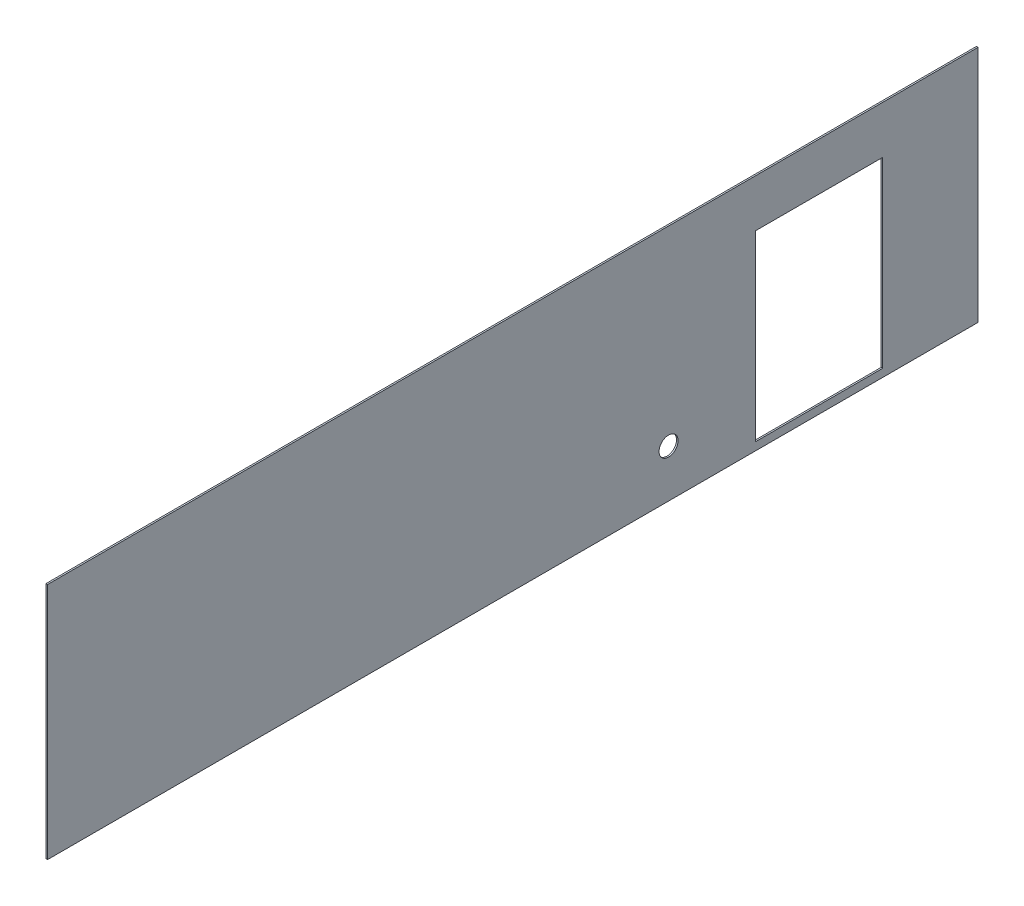
ISO-10303-21;
HEADER;
FILE_DESCRIPTION(('STEP AP214'),'2;1');
FILE_NAME('part.step','',(''),(''),'','','');
FILE_SCHEMA(('AUTOMOTIVE_DESIGN { 1 0 10303 214 1 1 1 1 }'));
ENDSEC;
DATA;
#1=APPLICATION_CONTEXT('core data for automotive mechanical design processes');
#2=APPLICATION_PROTOCOL_DEFINITION('international standard','automotive_design',2000,#1);
#3=PRODUCT_CONTEXT('',#1,'mechanical');
#4=PRODUCT('Part','Part','',(#3));
#5=PRODUCT_RELATED_PRODUCT_CATEGORY('part','',(#4));
#6=PRODUCT_DEFINITION_FORMATION('','',#4);
#7=PRODUCT_DEFINITION_CONTEXT('part definition',#1,'design');
#8=PRODUCT_DEFINITION('design','',#6,#7);
#9=PRODUCT_DEFINITION_SHAPE('','',#8);
#10=(LENGTH_UNIT() NAMED_UNIT(*) SI_UNIT(.MILLI.,.METRE.));
#11=(NAMED_UNIT(*) PLANE_ANGLE_UNIT() SI_UNIT($,.RADIAN.));
#12=(NAMED_UNIT(*) SI_UNIT($,.STERADIAN.) SOLID_ANGLE_UNIT());
#13=UNCERTAINTY_MEASURE_WITH_UNIT(LENGTH_MEASURE(1.E-05),#10,'distance_accuracy_value','');
#14=(GEOMETRIC_REPRESENTATION_CONTEXT(3) GLOBAL_UNCERTAINTY_ASSIGNED_CONTEXT((#13)) GLOBAL_UNIT_ASSIGNED_CONTEXT((#10,
#11,#12)) REPRESENTATION_CONTEXT('',''));
#15=CARTESIAN_POINT('',(0.,0.,0.));
#16=DIRECTION('',(0.,0.,1.));
#17=DIRECTION('',(1.,0.,0.));
#18=AXIS2_PLACEMENT_3D('',#15,#16,#17);
#19=CARTESIAN_POINT('',(0.,0.,-371.948016104997));
#20=DIRECTION('',(0.,0.,1.));
#21=DIRECTION('',(1.,0.,0.));
#22=AXIS2_PLACEMENT_3D('',#19,#20,#21);
#23=PLANE('',#22);
#24=DIRECTION('',(0.,1.,0.));
#25=VECTOR('',#24,1.);
#26=CARTESIAN_POINT('',(-235.9025,47.625,-371.948016104997));
#27=LINE('',#26,#25);
#28=CARTESIAN_POINT('',(-235.9025,-47.625,-371.948016104997));
#29=VERTEX_POINT('',#28);
#30=CARTESIAN_POINT('',(-235.9025,47.625,-371.948016104997));
#31=VERTEX_POINT('',#30);
#32=EDGE_CURVE('E212',#29,#31,#27,.T.);
#33=ORIENTED_EDGE('',*,*,#32,.F.);
#34=DIRECTION('',(-1.,0.,0.));
#35=VECTOR('',#34,1.);
#36=CARTESIAN_POINT('',(-236.5375,-47.625,-371.948016104997));
#37=LINE('',#36,#35);
#38=CARTESIAN_POINT('',(-236.5375,-47.625,-371.948016104997));
#39=VERTEX_POINT('',#38);
#40=EDGE_CURVE('E154',#29,#39,#37,.T.);
#41=ORIENTED_EDGE('',*,*,#40,.T.);
#42=DIRECTION('',(0.,1.,0.));
#43=VECTOR('',#42,1.);
#44=CARTESIAN_POINT('',(-236.5375,47.625,-371.948016104997));
#45=LINE('',#44,#43);
#46=CARTESIAN_POINT('',(-236.5375,47.625,-371.948016104997));
#47=VERTEX_POINT('',#46);
#48=EDGE_CURVE('E162',#39,#47,#45,.T.);
#49=ORIENTED_EDGE('',*,*,#48,.T.);
#50=DIRECTION('',(1.,0.,0.));
#51=VECTOR('',#50,1.);
#52=CARTESIAN_POINT('',(-236.5375,47.625,-371.948016104997));
#53=LINE('',#52,#51);
#54=EDGE_CURVE('E150',#47,#31,#53,.T.);
#55=ORIENTED_EDGE('',*,*,#54,.T.);
#56=EDGE_LOOP('',(#33,#41,#49,#55));
#57=FACE_BOUND('',#56,.T.);
#58=ADVANCED_FACE('F63',(#57),#23,.F.);
#59=CARTESIAN_POINT('',(144.4625,-28.575,-248.250016104997));
#60=DIRECTION('',(-1.,0.,0.));
#61=DIRECTION('',(0.,0.,1.));
#62=AXIS2_PLACEMENT_3D('',#59,#60,#61);
#63=CYLINDRICAL_SURFACE('',#62,3.81000000000004);
#64=CARTESIAN_POINT('',(-236.5375,-28.575,-248.250016104997));
#65=DIRECTION('',(-1.,0.,0.));
#66=DIRECTION('',(0.,0.,1.));
#67=AXIS2_PLACEMENT_3D('',#64,#65,#66);
#68=CIRCLE('',#67,3.81000000000004);
#69=CARTESIAN_POINT('',(-236.5375,-28.575,-244.440016104997));
#70=VERTEX_POINT('',#69);
#71=EDGE_CURVE('E166',#70,#70,#68,.T.);
#72=ORIENTED_EDGE('',*,*,#71,.T.);
#73=EDGE_LOOP('',(#72));
#74=FACE_BOUND('',#73,.T.);
#75=CARTESIAN_POINT('',(-235.9025,-28.575,-248.250016104997));
#76=DIRECTION('',(1.,0.,0.));
#77=DIRECTION('',(0.,0.,-1.));
#78=AXIS2_PLACEMENT_3D('',#75,#76,#77);
#79=CIRCLE('',#78,3.81000000000004);
#80=CARTESIAN_POINT('',(-235.9025,-28.575,-252.060016104997));
#81=VERTEX_POINT('',#80);
#82=EDGE_CURVE('E171',#81,#81,#79,.F.);
#83=ORIENTED_EDGE('',*,*,#82,.F.);
#84=EDGE_LOOP('',(#83));
#85=FACE_BOUND('',#84,.T.);
#86=ADVANCED_FACE('F226',(#74,#85),#63,.F.);
#87=CARTESIAN_POINT('',(144.4625,28.575,-333.848016104997));
#88=DIRECTION('',(0.,0.,-1.));
#89=DIRECTION('',(-1.,0.,0.));
#90=AXIS2_PLACEMENT_3D('',#87,#88,#89);
#91=PLANE('',#90);
#92=DIRECTION('',(0.,-1.,0.));
#93=VECTOR('',#92,1.);
#94=CARTESIAN_POINT('',(-235.9025,28.575,-333.848016104997));
#95=LINE('',#94,#93);
#96=CARTESIAN_POINT('',(-235.9025,28.575,-333.848016104997));
#97=VERTEX_POINT('',#96);
#98=CARTESIAN_POINT('',(-235.9025,-44.45,-333.848016104997));
#99=VERTEX_POINT('',#98);
#100=EDGE_CURVE('E86',#97,#99,#95,.T.);
#101=ORIENTED_EDGE('',*,*,#100,.F.);
#102=DIRECTION('',(-1.,0.,0.));
#103=VECTOR('',#102,1.);
#104=CARTESIAN_POINT('',(144.4625,28.575,-333.848016104997));
#105=LINE('',#104,#103);
#106=CARTESIAN_POINT('',(-236.5375,28.575,-333.848016104997));
#107=VERTEX_POINT('',#106);
#108=EDGE_CURVE('E165',#97,#107,#105,.T.);
#109=ORIENTED_EDGE('',*,*,#108,.T.);
#110=DIRECTION('',(0.,-1.,0.));
#111=VECTOR('',#110,1.);
#112=CARTESIAN_POINT('',(-236.5375,28.575,-333.848016104997));
#113=LINE('',#112,#111);
#114=CARTESIAN_POINT('',(-236.5375,-44.45,-333.848016104997));
#115=VERTEX_POINT('',#114);
#116=EDGE_CURVE('E170',#107,#115,#113,.T.);
#117=ORIENTED_EDGE('',*,*,#116,.T.);
#118=DIRECTION('',(-1.,0.,0.));
#119=VECTOR('',#118,1.);
#120=CARTESIAN_POINT('',(144.4625,-44.45,-333.848016104997));
#121=LINE('',#120,#119);
#122=EDGE_CURVE('E172',#99,#115,#121,.T.);
#123=ORIENTED_EDGE('',*,*,#122,.F.);
#124=EDGE_LOOP('',(#101,#109,#117,#123));
#125=FACE_BOUND('',#124,.T.);
#126=ADVANCED_FACE('F231',(#125),#91,.F.);
#127=CARTESIAN_POINT('',(144.4625,28.575,-333.848016104997));
#128=DIRECTION('',(0.,1.,0.));
#129=DIRECTION('',(0.,0.,1.));
#130=AXIS2_PLACEMENT_3D('',#127,#128,#129);
#131=PLANE('',#130);
#132=DIRECTION('',(0.,0.,-1.));
#133=VECTOR('',#132,1.);
#134=CARTESIAN_POINT('',(-235.9025,28.575,-333.848016104997));
#135=LINE('',#134,#133);
#136=CARTESIAN_POINT('',(-235.9025,28.575,-283.048016104997));
#137=VERTEX_POINT('',#136);
#138=EDGE_CURVE('E203',#137,#97,#135,.T.);
#139=ORIENTED_EDGE('',*,*,#138,.F.);
#140=DIRECTION('',(-1.,0.,0.));
#141=VECTOR('',#140,1.);
#142=CARTESIAN_POINT('',(144.4625,28.575,-283.048016104997));
#143=LINE('',#142,#141);
#144=CARTESIAN_POINT('',(-236.5375,28.575,-283.048016104997));
#145=VERTEX_POINT('',#144);
#146=EDGE_CURVE('E179',#137,#145,#143,.T.);
#147=ORIENTED_EDGE('',*,*,#146,.T.);
#148=DIRECTION('',(0.,0.,-1.));
#149=VECTOR('',#148,1.);
#150=CARTESIAN_POINT('',(-236.5375,28.575,-333.848016104997));
#151=LINE('',#150,#149);
#152=EDGE_CURVE('E176',#145,#107,#151,.T.);
#153=ORIENTED_EDGE('',*,*,#152,.T.);
#154=ORIENTED_EDGE('',*,*,#108,.F.);
#155=EDGE_LOOP('',(#139,#147,#153,#154));
#156=FACE_BOUND('',#155,.T.);
#157=ADVANCED_FACE('F258',(#156),#131,.F.);
#158=CARTESIAN_POINT('',(144.4625,28.575,-283.048016104997));
#159=DIRECTION('',(0.,0.,1.));
#160=DIRECTION('',(1.,0.,0.));
#161=AXIS2_PLACEMENT_3D('',#158,#159,#160);
#162=PLANE('',#161);
#163=DIRECTION('',(0.,1.,0.));
#164=VECTOR('',#163,1.);
#165=CARTESIAN_POINT('',(-235.9025,28.575,-283.048016104997));
#166=LINE('',#165,#164);
#167=CARTESIAN_POINT('',(-235.9025,-44.45,-283.048016104997));
#168=VERTEX_POINT('',#167);
#169=EDGE_CURVE('E206',#168,#137,#166,.T.);
#170=ORIENTED_EDGE('',*,*,#169,.F.);
#171=DIRECTION('',(-1.,0.,0.));
#172=VECTOR('',#171,1.);
#173=CARTESIAN_POINT('',(144.4625,-44.45,-283.048016104997));
#174=LINE('',#173,#172);
#175=CARTESIAN_POINT('',(-236.5375,-44.45,-283.048016104997));
#176=VERTEX_POINT('',#175);
#177=EDGE_CURVE('E175',#168,#176,#174,.T.);
#178=ORIENTED_EDGE('',*,*,#177,.T.);
#179=DIRECTION('',(0.,1.,0.));
#180=VECTOR('',#179,1.);
#181=CARTESIAN_POINT('',(-236.5375,28.575,-283.048016104997));
#182=LINE('',#181,#180);
#183=EDGE_CURVE('E187',#176,#145,#182,.T.);
#184=ORIENTED_EDGE('',*,*,#183,.T.);
#185=ORIENTED_EDGE('',*,*,#146,.F.);
#186=EDGE_LOOP('',(#170,#178,#184,#185));
#187=FACE_BOUND('',#186,.T.);
#188=ADVANCED_FACE('F261',(#187),#162,.F.);
#189=CARTESIAN_POINT('',(144.4625,-44.45,-333.848016104997));
#190=DIRECTION('',(0.,-1.,0.));
#191=DIRECTION('',(0.,0.,-1.));
#192=AXIS2_PLACEMENT_3D('',#189,#190,#191);
#193=PLANE('',#192);
#194=DIRECTION('',(0.,0.,1.));
#195=VECTOR('',#194,1.);
#196=CARTESIAN_POINT('',(-235.9025,-44.45,-333.848016104997));
#197=LINE('',#196,#195);
#198=EDGE_CURVE('E12',#99,#168,#197,.T.);
#199=ORIENTED_EDGE('',*,*,#198,.F.);
#200=ORIENTED_EDGE('',*,*,#122,.T.);
#201=DIRECTION('',(0.,0.,1.));
#202=VECTOR('',#201,1.);
#203=CARTESIAN_POINT('',(-236.5375,-44.45,-333.848016104997));
#204=LINE('',#203,#202);
#205=EDGE_CURVE('E191',#115,#176,#204,.T.);
#206=ORIENTED_EDGE('',*,*,#205,.T.);
#207=ORIENTED_EDGE('',*,*,#177,.F.);
#208=EDGE_LOOP('',(#199,#200,#206,#207));
#209=FACE_BOUND('',#208,.T.);
#210=ADVANCED_FACE('F242',(#209),#193,.F.);
#211=CARTESIAN_POINT('',(-236.5375,47.625,3.175));
#212=DIRECTION('',(0.,-1.,0.));
#213=DIRECTION('',(0.,0.,-1.));
#214=AXIS2_PLACEMENT_3D('',#211,#212,#213);
#215=PLANE('',#214);
#216=DIRECTION('',(0.,0.,-1.));
#217=VECTOR('',#216,1.);
#218=CARTESIAN_POINT('',(-236.5375,47.625,3.175));
#219=LINE('',#218,#217);
#220=CARTESIAN_POINT('',(-236.5375,47.625,-1.11022302462516E-13));
#221=VERTEX_POINT('',#220);
#222=EDGE_CURVE('E72',#221,#47,#219,.T.);
#223=ORIENTED_EDGE('',*,*,#222,.F.);
#224=DIRECTION('',(-1.,0.,0.));
#225=VECTOR('',#224,1.);
#226=CARTESIAN_POINT('',(236.5375,47.625,0.));
#227=LINE('',#226,#225);
#228=CARTESIAN_POINT('',(-235.9025,47.625,0.));
#229=VERTEX_POINT('',#228);
#230=EDGE_CURVE('E128',#229,#221,#227,.T.);
#231=ORIENTED_EDGE('',*,*,#230,.F.);
#232=DIRECTION('',(0.,0.,1.));
#233=VECTOR('',#232,1.);
#234=CARTESIAN_POINT('',(-235.9025,47.625,0.));
#235=LINE('',#234,#233);
#236=EDGE_CURVE('E209',#31,#229,#235,.T.);
#237=ORIENTED_EDGE('',*,*,#236,.F.);
#238=ORIENTED_EDGE('',*,*,#54,.F.);
#239=EDGE_LOOP('',(#223,#231,#237,#238));
#240=FACE_BOUND('',#239,.T.);
#241=ADVANCED_FACE('F65',(#240),#215,.F.);
#242=CARTESIAN_POINT('',(-236.5375,-47.625,3.175));
#243=DIRECTION('',(1.,0.,0.));
#244=DIRECTION('',(0.,0.,-1.));
#245=AXIS2_PLACEMENT_3D('',#242,#243,#244);
#246=PLANE('',#245);
#247=ORIENTED_EDGE('',*,*,#205,.F.);
#248=ORIENTED_EDGE('',*,*,#116,.F.);
#249=ORIENTED_EDGE('',*,*,#152,.F.);
#250=ORIENTED_EDGE('',*,*,#183,.F.);
#251=EDGE_LOOP('',(#247,#248,#249,#250));
#252=FACE_BOUND('',#251,.T.);
#253=ORIENTED_EDGE('',*,*,#71,.F.);
#254=EDGE_LOOP('',(#253));
#255=FACE_BOUND('',#254,.T.);
#256=DIRECTION('',(0.,0.,-1.));
#257=VECTOR('',#256,1.);
#258=CARTESIAN_POINT('',(-236.5375,-47.625,3.175));
#259=LINE('',#258,#257);
#260=CARTESIAN_POINT('',(-236.5375,-47.625,0.));
#261=VERTEX_POINT('',#260);
#262=EDGE_CURVE('E145',#261,#39,#259,.T.);
#263=ORIENTED_EDGE('',*,*,#262,.F.);
#264=DIRECTION('',(0.,-1.,0.));
#265=VECTOR('',#264,1.);
#266=CARTESIAN_POINT('',(-236.5375,47.625,0.));
#267=LINE('',#266,#265);
#268=EDGE_CURVE('E131',#221,#261,#267,.T.);
#269=ORIENTED_EDGE('',*,*,#268,.F.);
#270=ORIENTED_EDGE('',*,*,#222,.T.);
#271=ORIENTED_EDGE('',*,*,#48,.F.);
#272=EDGE_LOOP('',(#263,#269,#270,#271));
#273=FACE_BOUND('',#272,.T.);
#274=ADVANCED_FACE('F142',(#252,#255,#273),#246,.F.);
#275=CARTESIAN_POINT('',(-236.5375,-47.625,3.175));
#276=DIRECTION('',(0.,1.,0.));
#277=DIRECTION('',(0.,0.,1.));
#278=AXIS2_PLACEMENT_3D('',#275,#276,#277);
#279=PLANE('',#278);
#280=DIRECTION('',(0.,0.,-1.));
#281=VECTOR('',#280,1.);
#282=CARTESIAN_POINT('',(-235.9025,-47.625,0.));
#283=LINE('',#282,#281);
#284=CARTESIAN_POINT('',(-235.9025,-47.625,0.));
#285=VERTEX_POINT('',#284);
#286=EDGE_CURVE('E79',#285,#29,#283,.T.);
#287=ORIENTED_EDGE('',*,*,#286,.F.);
#288=DIRECTION('',(1.,0.,0.));
#289=VECTOR('',#288,1.);
#290=CARTESIAN_POINT('',(236.5375,-47.625,0.));
#291=LINE('',#290,#289);
#292=EDGE_CURVE('E147',#261,#285,#291,.T.);
#293=ORIENTED_EDGE('',*,*,#292,.F.);
#294=ORIENTED_EDGE('',*,*,#262,.T.);
#295=ORIENTED_EDGE('',*,*,#40,.F.);
#296=EDGE_LOOP('',(#287,#293,#294,#295));
#297=FACE_BOUND('',#296,.T.);
#298=ADVANCED_FACE('F223',(#297),#279,.F.);
#299=CARTESIAN_POINT('',(-235.9025,0.,0.));
#300=DIRECTION('',(1.,0.,0.));
#301=DIRECTION('',(0.,0.,-1.));
#302=AXIS2_PLACEMENT_3D('',#299,#300,#301);
#303=PLANE('',#302);
#304=DIRECTION('',(0.,-1.,0.));
#305=VECTOR('',#304,1.);
#306=CARTESIAN_POINT('',(-235.9025,47.625,0.));
#307=LINE('',#306,#305);
#308=EDGE_CURVE('E133',#229,#285,#307,.T.);
#309=ORIENTED_EDGE('',*,*,#308,.T.);
#310=ORIENTED_EDGE('',*,*,#286,.T.);
#311=ORIENTED_EDGE('',*,*,#32,.T.);
#312=ORIENTED_EDGE('',*,*,#236,.T.);
#313=EDGE_LOOP('',(#309,#310,#311,#312));
#314=FACE_BOUND('',#313,.T.);
#315=ORIENTED_EDGE('',*,*,#100,.T.);
#316=ORIENTED_EDGE('',*,*,#198,.T.);
#317=ORIENTED_EDGE('',*,*,#169,.T.);
#318=ORIENTED_EDGE('',*,*,#138,.T.);
#319=EDGE_LOOP('',(#315,#316,#317,#318));
#320=FACE_BOUND('',#319,.T.);
#321=ORIENTED_EDGE('',*,*,#82,.T.);
#322=EDGE_LOOP('',(#321));
#323=FACE_BOUND('',#322,.T.);
#324=ADVANCED_FACE('F221',(#314,#320,#323),#303,.T.);
#325=CARTESIAN_POINT('',(0.,0.,0.));
#326=DIRECTION('',(0.,0.,-1.));
#327=DIRECTION('',(-1.,0.,0.));
#328=AXIS2_PLACEMENT_3D('',#325,#326,#327);
#329=PLANE('',#328);
#330=ORIENTED_EDGE('',*,*,#308,.F.);
#331=ORIENTED_EDGE('',*,*,#230,.T.);
#332=ORIENTED_EDGE('',*,*,#268,.T.);
#333=ORIENTED_EDGE('',*,*,#292,.T.);
#334=EDGE_LOOP('',(#330,#331,#332,#333));
#335=FACE_BOUND('',#334,.T.);
#336=ADVANCED_FACE('F130',(#335),#329,.F.);
#337=CLOSED_SHELL('',(#58,#86,#126,#157,#188,#210,#241,#274,#298,#324,#336));
#338=MANIFOLD_SOLID_BREP('B2',#337);
#339=ADVANCED_BREP_SHAPE_REPRESENTATION('',(#18,#338),#14);
#340=SHAPE_DEFINITION_REPRESENTATION(#9,#339);
ENDSEC;
END-ISO-10303-21;
